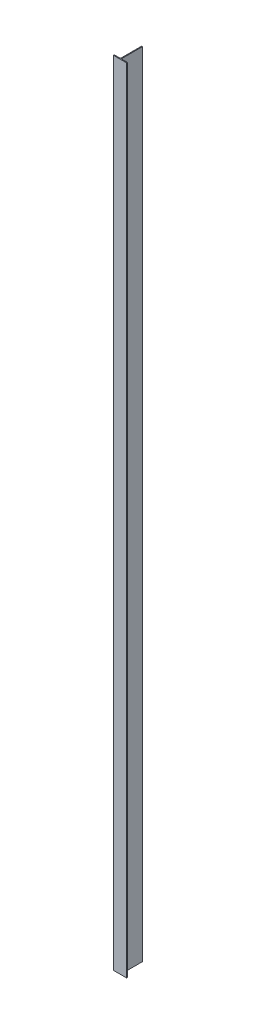
ISO-10303-21;
HEADER;
FILE_DESCRIPTION(('STEP AP214'),'2;1');
FILE_NAME('part.step','',(''),(''),'','','');
FILE_SCHEMA(('AUTOMOTIVE_DESIGN { 1 0 10303 214 1 1 1 1 }'));
ENDSEC;
DATA;
#1=APPLICATION_CONTEXT('core data for automotive mechanical design processes');
#2=APPLICATION_PROTOCOL_DEFINITION('international standard','automotive_design',2000,#1);
#3=PRODUCT_CONTEXT('',#1,'mechanical');
#4=PRODUCT('Part','Part','',(#3));
#5=PRODUCT_RELATED_PRODUCT_CATEGORY('part','',(#4));
#6=PRODUCT_DEFINITION_FORMATION('','',#4);
#7=PRODUCT_DEFINITION_CONTEXT('part definition',#1,'design');
#8=PRODUCT_DEFINITION('design','',#6,#7);
#9=PRODUCT_DEFINITION_SHAPE('','',#8);
#10=(LENGTH_UNIT() NAMED_UNIT(*) SI_UNIT(.MILLI.,.METRE.));
#11=(NAMED_UNIT(*) PLANE_ANGLE_UNIT() SI_UNIT($,.RADIAN.));
#12=(NAMED_UNIT(*) SI_UNIT($,.STERADIAN.) SOLID_ANGLE_UNIT());
#13=UNCERTAINTY_MEASURE_WITH_UNIT(LENGTH_MEASURE(1.E-05),#10,'distance_accuracy_value','');
#14=(GEOMETRIC_REPRESENTATION_CONTEXT(3) GLOBAL_UNCERTAINTY_ASSIGNED_CONTEXT((#13)) GLOBAL_UNIT_ASSIGNED_CONTEXT((#10,
#11,#12)) REPRESENTATION_CONTEXT('',''));
#15=CARTESIAN_POINT('',(0.,0.,0.));
#16=DIRECTION('',(0.,0.,1.));
#17=DIRECTION('',(1.,0.,0.));
#18=AXIS2_PLACEMENT_3D('',#15,#16,#17);
#19=CARTESIAN_POINT('',(714.,1610.,40.));
#20=DIRECTION('',(0.,0.,-1.));
#21=DIRECTION('',(-1.,0.,0.));
#22=AXIS2_PLACEMENT_3D('',#19,#20,#21);
#23=PLANE('',#22);
#24=DIRECTION('',(1.,0.,0.));
#25=VECTOR('',#24,1.);
#26=CARTESIAN_POINT('',(714.,182.5,40.));
#27=LINE('',#26,#25);
#28=CARTESIAN_POINT('',(690.,182.5,40.));
#29=VERTEX_POINT('',#28);
#30=CARTESIAN_POINT('',(714.,182.5,40.));
#31=VERTEX_POINT('',#30);
#32=EDGE_CURVE('E135',#29,#31,#27,.T.);
#33=ORIENTED_EDGE('',*,*,#32,.T.);
#34=DIRECTION('',(0.,-1.,0.));
#35=VECTOR('',#34,1.);
#36=CARTESIAN_POINT('',(714.,1610.,40.));
#37=LINE('',#36,#35);
#38=CARTESIAN_POINT('',(714.,1610.,40.));
#39=VERTEX_POINT('',#38);
#40=EDGE_CURVE('E11',#39,#31,#37,.T.);
#41=ORIENTED_EDGE('',*,*,#40,.F.);
#42=DIRECTION('',(1.,0.,0.));
#43=VECTOR('',#42,1.);
#44=CARTESIAN_POINT('',(714.,1610.,40.));
#45=LINE('',#44,#43);
#46=CARTESIAN_POINT('',(690.,1610.,40.));
#47=VERTEX_POINT('',#46);
#48=EDGE_CURVE('E149',#47,#39,#45,.T.);
#49=ORIENTED_EDGE('',*,*,#48,.F.);
#50=DIRECTION('',(0.,-1.,0.));
#51=VECTOR('',#50,1.);
#52=CARTESIAN_POINT('',(690.,1610.,40.));
#53=LINE('',#52,#51);
#54=EDGE_CURVE('E131',#47,#29,#53,.T.);
#55=ORIENTED_EDGE('',*,*,#54,.T.);
#56=EDGE_LOOP('',(#33,#41,#49,#55));
#57=FACE_BOUND('',#56,.T.);
#58=ADVANCED_FACE('F39',(#57),#23,.F.);
#59=CARTESIAN_POINT('',(714.,1610.,38.5));
#60=DIRECTION('',(-1.,0.,0.));
#61=DIRECTION('',(0.,0.,1.));
#62=AXIS2_PLACEMENT_3D('',#59,#60,#61);
#63=PLANE('',#62);
#64=DIRECTION('',(0.,0.,-1.));
#65=VECTOR('',#64,1.);
#66=CARTESIAN_POINT('',(714.,182.5,38.5));
#67=LINE('',#66,#65);
#68=CARTESIAN_POINT('',(714.,182.5,38.5));
#69=VERTEX_POINT('',#68);
#70=EDGE_CURVE('E138',#31,#69,#67,.T.);
#71=ORIENTED_EDGE('',*,*,#70,.T.);
#72=DIRECTION('',(0.,-1.,0.));
#73=VECTOR('',#72,1.);
#74=CARTESIAN_POINT('',(714.,1610.,38.5));
#75=LINE('',#74,#73);
#76=CARTESIAN_POINT('',(714.,1610.,38.5));
#77=VERTEX_POINT('',#76);
#78=EDGE_CURVE('E47',#77,#69,#75,.T.);
#79=ORIENTED_EDGE('',*,*,#78,.F.);
#80=DIRECTION('',(0.,0.,-1.));
#81=VECTOR('',#80,1.);
#82=CARTESIAN_POINT('',(714.,1610.,38.5));
#83=LINE('',#82,#81);
#84=EDGE_CURVE('E98',#39,#77,#83,.T.);
#85=ORIENTED_EDGE('',*,*,#84,.F.);
#86=ORIENTED_EDGE('',*,*,#40,.T.);
#87=EDGE_LOOP('',(#71,#79,#85,#86));
#88=FACE_BOUND('',#87,.T.);
#89=ADVANCED_FACE('F184',(#88),#63,.F.);
#90=CARTESIAN_POINT('',(702.75,1610.,38.5));
#91=DIRECTION('',(0.,0.,1.));
#92=DIRECTION('',(1.,0.,0.));
#93=AXIS2_PLACEMENT_3D('',#90,#91,#92);
#94=PLANE('',#93);
#95=DIRECTION('',(-1.,0.,0.));
#96=VECTOR('',#95,1.);
#97=CARTESIAN_POINT('',(702.75,182.5,38.5));
#98=LINE('',#97,#96);
#99=CARTESIAN_POINT('',(702.75,182.5,38.5));
#100=VERTEX_POINT('',#99);
#101=EDGE_CURVE('E140',#69,#100,#98,.T.);
#102=ORIENTED_EDGE('',*,*,#101,.T.);
#103=DIRECTION('',(0.,-1.,0.));
#104=VECTOR('',#103,1.);
#105=CARTESIAN_POINT('',(702.75,1610.,38.5));
#106=LINE('',#105,#104);
#107=CARTESIAN_POINT('',(702.75,1610.,38.5));
#108=VERTEX_POINT('',#107);
#109=EDGE_CURVE('E156',#108,#100,#106,.T.);
#110=ORIENTED_EDGE('',*,*,#109,.F.);
#111=DIRECTION('',(-1.,0.,0.));
#112=VECTOR('',#111,1.);
#113=CARTESIAN_POINT('',(702.75,1610.,38.5));
#114=LINE('',#113,#112);
#115=EDGE_CURVE('E164',#77,#108,#114,.T.);
#116=ORIENTED_EDGE('',*,*,#115,.F.);
#117=ORIENTED_EDGE('',*,*,#78,.T.);
#118=EDGE_LOOP('',(#102,#110,#116,#117));
#119=FACE_BOUND('',#118,.T.);
#120=ADVANCED_FACE('F162',(#119),#94,.F.);
#121=CARTESIAN_POINT('',(702.75,1610.,0.));
#122=DIRECTION('',(-1.,0.,0.));
#123=DIRECTION('',(0.,0.,1.));
#124=AXIS2_PLACEMENT_3D('',#121,#122,#123);
#125=PLANE('',#124);
#126=DIRECTION('',(0.,0.,-1.));
#127=VECTOR('',#126,1.);
#128=CARTESIAN_POINT('',(702.75,182.5,0.));
#129=LINE('',#128,#127);
#130=CARTESIAN_POINT('',(702.75,182.5,0.));
#131=VERTEX_POINT('',#130);
#132=EDGE_CURVE('E142',#100,#131,#129,.T.);
#133=ORIENTED_EDGE('',*,*,#132,.T.);
#134=DIRECTION('',(0.,-1.,0.));
#135=VECTOR('',#134,1.);
#136=CARTESIAN_POINT('',(702.75,1610.,0.));
#137=LINE('',#136,#135);
#138=CARTESIAN_POINT('',(702.75,1610.,0.));
#139=VERTEX_POINT('',#138);
#140=EDGE_CURVE('E153',#139,#131,#137,.T.);
#141=ORIENTED_EDGE('',*,*,#140,.F.);
#142=DIRECTION('',(0.,0.,-1.));
#143=VECTOR('',#142,1.);
#144=CARTESIAN_POINT('',(702.75,1610.,0.));
#145=LINE('',#144,#143);
#146=EDGE_CURVE('E176',#108,#139,#145,.T.);
#147=ORIENTED_EDGE('',*,*,#146,.F.);
#148=ORIENTED_EDGE('',*,*,#109,.T.);
#149=EDGE_LOOP('',(#133,#141,#147,#148));
#150=FACE_BOUND('',#149,.T.);
#151=ADVANCED_FACE('F172',(#150),#125,.F.);
#152=CARTESIAN_POINT('',(701.25,1610.,0.));
#153=DIRECTION('',(0.,0.,1.));
#154=DIRECTION('',(1.,0.,0.));
#155=AXIS2_PLACEMENT_3D('',#152,#153,#154);
#156=PLANE('',#155);
#157=DIRECTION('',(-1.,0.,0.));
#158=VECTOR('',#157,1.);
#159=CARTESIAN_POINT('',(701.25,182.5,0.));
#160=LINE('',#159,#158);
#161=CARTESIAN_POINT('',(701.25,182.5,0.));
#162=VERTEX_POINT('',#161);
#163=EDGE_CURVE('E144',#131,#162,#160,.T.);
#164=ORIENTED_EDGE('',*,*,#163,.T.);
#165=DIRECTION('',(0.,-1.,0.));
#166=VECTOR('',#165,1.);
#167=CARTESIAN_POINT('',(701.25,1610.,0.));
#168=LINE('',#167,#166);
#169=CARTESIAN_POINT('',(701.25,1610.,0.));
#170=VERTEX_POINT('',#169);
#171=EDGE_CURVE('E126',#170,#162,#168,.T.);
#172=ORIENTED_EDGE('',*,*,#171,.F.);
#173=DIRECTION('',(-1.,0.,0.));
#174=VECTOR('',#173,1.);
#175=CARTESIAN_POINT('',(701.25,1610.,0.));
#176=LINE('',#175,#174);
#177=EDGE_CURVE('E117',#139,#170,#176,.T.);
#178=ORIENTED_EDGE('',*,*,#177,.F.);
#179=ORIENTED_EDGE('',*,*,#140,.T.);
#180=EDGE_LOOP('',(#164,#172,#178,#179));
#181=FACE_BOUND('',#180,.T.);
#182=ADVANCED_FACE('F175',(#181),#156,.F.);
#183=CARTESIAN_POINT('',(701.25,1610.,38.5));
#184=DIRECTION('',(1.,0.,0.));
#185=DIRECTION('',(0.,0.,-1.));
#186=AXIS2_PLACEMENT_3D('',#183,#184,#185);
#187=PLANE('',#186);
#188=DIRECTION('',(0.,0.,1.));
#189=VECTOR('',#188,1.);
#190=CARTESIAN_POINT('',(701.25,182.5,38.5));
#191=LINE('',#190,#189);
#192=CARTESIAN_POINT('',(701.25,182.5,38.5));
#193=VERTEX_POINT('',#192);
#194=EDGE_CURVE('E125',#162,#193,#191,.T.);
#195=ORIENTED_EDGE('',*,*,#194,.T.);
#196=DIRECTION('',(0.,-1.,0.));
#197=VECTOR('',#196,1.);
#198=CARTESIAN_POINT('',(701.25,1610.,38.5));
#199=LINE('',#198,#197);
#200=CARTESIAN_POINT('',(701.25,1610.,38.5));
#201=VERTEX_POINT('',#200);
#202=EDGE_CURVE('E122',#201,#193,#199,.T.);
#203=ORIENTED_EDGE('',*,*,#202,.F.);
#204=DIRECTION('',(0.,0.,1.));
#205=VECTOR('',#204,1.);
#206=CARTESIAN_POINT('',(701.25,1610.,38.5));
#207=LINE('',#206,#205);
#208=EDGE_CURVE('E111',#170,#201,#207,.T.);
#209=ORIENTED_EDGE('',*,*,#208,.F.);
#210=ORIENTED_EDGE('',*,*,#171,.T.);
#211=EDGE_LOOP('',(#195,#203,#209,#210));
#212=FACE_BOUND('',#211,.T.);
#213=ADVANCED_FACE('F123',(#212),#187,.F.);
#214=CARTESIAN_POINT('',(690.,1610.,38.5));
#215=DIRECTION('',(0.,0.,1.));
#216=DIRECTION('',(1.,0.,0.));
#217=AXIS2_PLACEMENT_3D('',#214,#215,#216);
#218=PLANE('',#217);
#219=DIRECTION('',(-1.,0.,0.));
#220=VECTOR('',#219,1.);
#221=CARTESIAN_POINT('',(690.,182.5,38.5));
#222=LINE('',#221,#220);
#223=CARTESIAN_POINT('',(690.,182.5,38.5));
#224=VERTEX_POINT('',#223);
#225=EDGE_CURVE('E84',#193,#224,#222,.T.);
#226=ORIENTED_EDGE('',*,*,#225,.T.);
#227=DIRECTION('',(0.,-1.,0.));
#228=VECTOR('',#227,1.);
#229=CARTESIAN_POINT('',(690.,1610.,38.5));
#230=LINE('',#229,#228);
#231=CARTESIAN_POINT('',(690.,1610.,38.5));
#232=VERTEX_POINT('',#231);
#233=EDGE_CURVE('E127',#232,#224,#230,.T.);
#234=ORIENTED_EDGE('',*,*,#233,.F.);
#235=DIRECTION('',(-1.,0.,0.));
#236=VECTOR('',#235,1.);
#237=CARTESIAN_POINT('',(690.,1610.,38.5));
#238=LINE('',#237,#236);
#239=EDGE_CURVE('E115',#201,#232,#238,.T.);
#240=ORIENTED_EDGE('',*,*,#239,.F.);
#241=ORIENTED_EDGE('',*,*,#202,.T.);
#242=EDGE_LOOP('',(#226,#234,#240,#241));
#243=FACE_BOUND('',#242,.T.);
#244=ADVANCED_FACE('F129',(#243),#218,.F.);
#245=CARTESIAN_POINT('',(690.,1610.,40.));
#246=DIRECTION('',(1.,0.,0.));
#247=DIRECTION('',(0.,0.,-1.));
#248=AXIS2_PLACEMENT_3D('',#245,#246,#247);
#249=PLANE('',#248);
#250=DIRECTION('',(0.,0.,1.));
#251=VECTOR('',#250,1.);
#252=CARTESIAN_POINT('',(690.,182.5,40.));
#253=LINE('',#252,#251);
#254=EDGE_CURVE('E90',#224,#29,#253,.T.);
#255=ORIENTED_EDGE('',*,*,#254,.T.);
#256=ORIENTED_EDGE('',*,*,#54,.F.);
#257=DIRECTION('',(0.,0.,1.));
#258=VECTOR('',#257,1.);
#259=CARTESIAN_POINT('',(690.,1610.,40.));
#260=LINE('',#259,#258);
#261=EDGE_CURVE('E55',#232,#47,#260,.T.);
#262=ORIENTED_EDGE('',*,*,#261,.F.);
#263=ORIENTED_EDGE('',*,*,#233,.T.);
#264=EDGE_LOOP('',(#255,#256,#262,#263));
#265=FACE_BOUND('',#264,.T.);
#266=ADVANCED_FACE('F200',(#265),#249,.F.);
#267=CARTESIAN_POINT('',(0.,1610.,0.));
#268=DIRECTION('',(0.,-1.,0.));
#269=DIRECTION('',(0.,0.,-1.));
#270=AXIS2_PLACEMENT_3D('',#267,#268,#269);
#271=PLANE('',#270);
#272=ORIENTED_EDGE('',*,*,#48,.T.);
#273=ORIENTED_EDGE('',*,*,#84,.T.);
#274=ORIENTED_EDGE('',*,*,#115,.T.);
#275=ORIENTED_EDGE('',*,*,#146,.T.);
#276=ORIENTED_EDGE('',*,*,#177,.T.);
#277=ORIENTED_EDGE('',*,*,#208,.T.);
#278=ORIENTED_EDGE('',*,*,#239,.T.);
#279=ORIENTED_EDGE('',*,*,#261,.T.);
#280=EDGE_LOOP('',(#272,#273,#274,#275,#276,#277,#278,#279));
#281=FACE_BOUND('',#280,.T.);
#282=ADVANCED_FACE('F113',(#281),#271,.F.);
#283=CARTESIAN_POINT('',(0.,182.5,0.));
#284=DIRECTION('',(0.,-1.,0.));
#285=DIRECTION('',(0.,0.,-1.));
#286=AXIS2_PLACEMENT_3D('',#283,#284,#285);
#287=PLANE('',#286);
#288=ORIENTED_EDGE('',*,*,#32,.F.);
#289=ORIENTED_EDGE('',*,*,#254,.F.);
#290=ORIENTED_EDGE('',*,*,#225,.F.);
#291=ORIENTED_EDGE('',*,*,#194,.F.);
#292=ORIENTED_EDGE('',*,*,#163,.F.);
#293=ORIENTED_EDGE('',*,*,#132,.F.);
#294=ORIENTED_EDGE('',*,*,#101,.F.);
#295=ORIENTED_EDGE('',*,*,#70,.F.);
#296=EDGE_LOOP('',(#288,#289,#290,#291,#292,#293,#294,#295));
#297=FACE_BOUND('',#296,.T.);
#298=ADVANCED_FACE('F168',(#297),#287,.T.);
#299=CLOSED_SHELL('',(#58,#89,#120,#151,#182,#213,#244,#266,#282,#298));
#300=MANIFOLD_SOLID_BREP('B2',#299);
#301=ADVANCED_BREP_SHAPE_REPRESENTATION('',(#18,#300),#14);
#302=SHAPE_DEFINITION_REPRESENTATION(#9,#301);
ENDSEC;
END-ISO-10303-21;
